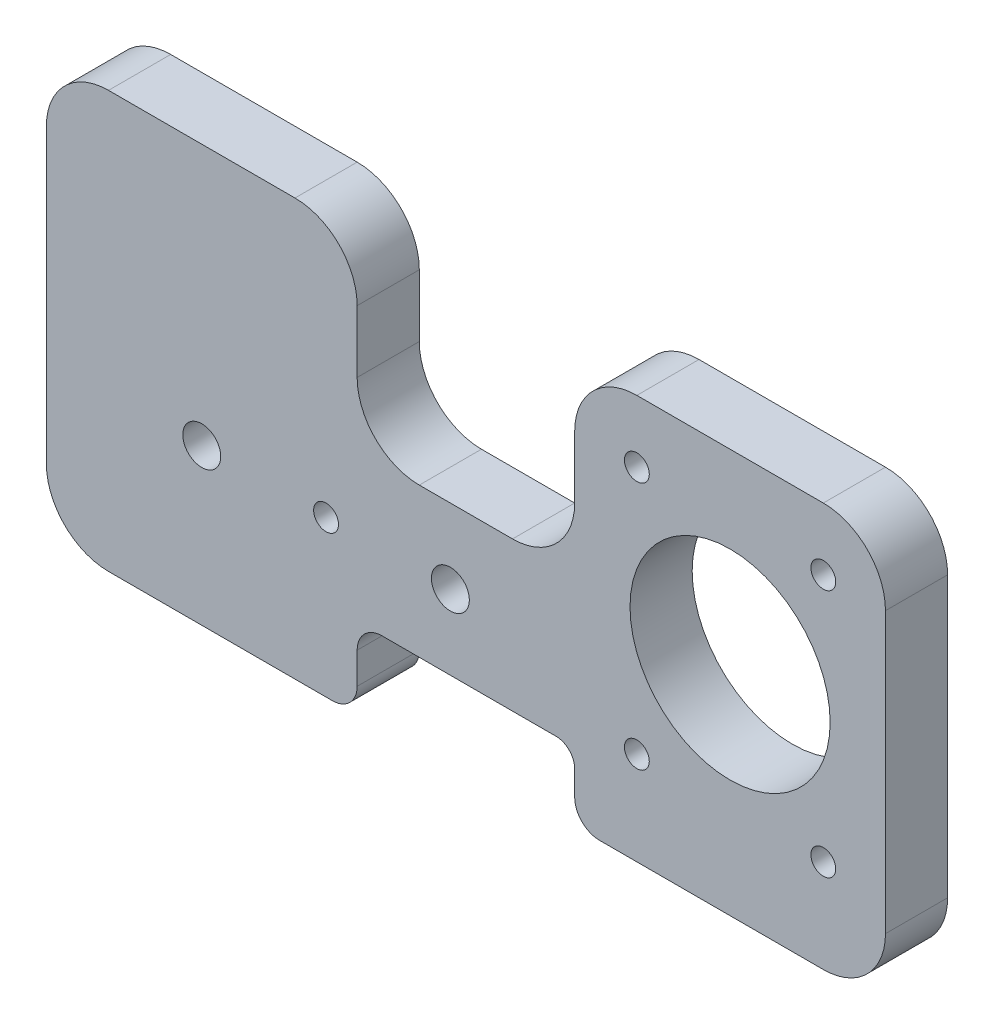
ISO-10303-21;
HEADER;
FILE_DESCRIPTION(('STEP AP214'),'2;1');
FILE_NAME('part.step','',(''),(''),'','','');
FILE_SCHEMA(('AUTOMOTIVE_DESIGN { 1 0 10303 214 1 1 1 1 }'));
ENDSEC;
DATA;
#1=APPLICATION_CONTEXT('core data for automotive mechanical design processes');
#2=APPLICATION_PROTOCOL_DEFINITION('international standard','automotive_design',2000,#1);
#3=PRODUCT_CONTEXT('',#1,'mechanical');
#4=PRODUCT('Part','Part','',(#3));
#5=PRODUCT_RELATED_PRODUCT_CATEGORY('part','',(#4));
#6=PRODUCT_DEFINITION_FORMATION('','',#4);
#7=PRODUCT_DEFINITION_CONTEXT('part definition',#1,'design');
#8=PRODUCT_DEFINITION('design','',#6,#7);
#9=PRODUCT_DEFINITION_SHAPE('','',#8);
#10=(LENGTH_UNIT() NAMED_UNIT(*) SI_UNIT(.MILLI.,.METRE.));
#11=(NAMED_UNIT(*) PLANE_ANGLE_UNIT() SI_UNIT($,.RADIAN.));
#12=(NAMED_UNIT(*) SI_UNIT($,.STERADIAN.) SOLID_ANGLE_UNIT());
#13=UNCERTAINTY_MEASURE_WITH_UNIT(LENGTH_MEASURE(1.E-05),#10,'distance_accuracy_value','');
#14=(GEOMETRIC_REPRESENTATION_CONTEXT(3) GLOBAL_UNCERTAINTY_ASSIGNED_CONTEXT((#13)) GLOBAL_UNIT_ASSIGNED_CONTEXT((#10,
#11,#12)) REPRESENTATION_CONTEXT('',''));
#15=CARTESIAN_POINT('',(0.,0.,0.));
#16=DIRECTION('',(0.,0.,1.));
#17=DIRECTION('',(1.,0.,0.));
#18=AXIS2_PLACEMENT_3D('',#15,#16,#17);
#19=CARTESIAN_POINT('',(110.9105691057,-0.999999999999983,10.));
#20=DIRECTION('',(0.,0.,1.));
#21=DIRECTION('',(1.,0.,0.));
#22=AXIS2_PLACEMENT_3D('',#19,#20,#21);
#23=PLANE('',#22);
#24=CARTESIAN_POINT('',(131.9105691057,30.,10.));
#25=DIRECTION('',(0.,0.,1.));
#26=DIRECTION('',(1.,0.,0.));
#27=AXIS2_PLACEMENT_3D('',#24,#25,#26);
#28=CIRCLE('',#27,16.1);
#29=CARTESIAN_POINT('',(148.0105691057,30.,10.));
#30=VERTEX_POINT('',#29);
#31=EDGE_CURVE('E457',#30,#30,#28,.T.);
#32=ORIENTED_EDGE('',*,*,#31,.F.);
#33=EDGE_LOOP('',(#32));
#34=FACE_BOUND('',#33,.T.);
#35=CARTESIAN_POINT('',(146.9105691057,50.,10.));
#36=DIRECTION('',(0.,0.,1.));
#37=DIRECTION('',(1.,0.,0.));
#38=AXIS2_PLACEMENT_3D('',#35,#36,#37);
#39=CIRCLE('',#38,1.99999999999997);
#40=CARTESIAN_POINT('',(148.9105691057,50.,10.));
#41=VERTEX_POINT('',#40);
#42=EDGE_CURVE('E474',#41,#41,#39,.T.);
#43=ORIENTED_EDGE('',*,*,#42,.F.);
#44=EDGE_LOOP('',(#43));
#45=FACE_BOUND('',#44,.T.);
#46=CARTESIAN_POINT('',(116.9105691057,10.,10.));
#47=DIRECTION('',(0.,0.,1.));
#48=DIRECTION('',(1.,0.,0.));
#49=AXIS2_PLACEMENT_3D('',#46,#47,#48);
#50=CIRCLE('',#49,2.00000000000002);
#51=CARTESIAN_POINT('',(118.9105691057,10.,10.));
#52=VERTEX_POINT('',#51);
#53=EDGE_CURVE('E486',#52,#52,#50,.T.);
#54=ORIENTED_EDGE('',*,*,#53,.F.);
#55=EDGE_LOOP('',(#54));
#56=FACE_BOUND('',#55,.T.);
#57=CARTESIAN_POINT('',(66.9105691057,18.,10.));
#58=DIRECTION('',(0.,0.,1.));
#59=DIRECTION('',(1.,0.,0.));
#60=AXIS2_PLACEMENT_3D('',#57,#58,#59);
#61=CIRCLE('',#60,1.99999999999999);
#62=CARTESIAN_POINT('',(68.9105691057,18.,10.));
#63=VERTEX_POINT('',#62);
#64=EDGE_CURVE('E230',#63,#63,#61,.T.);
#65=ORIENTED_EDGE('',*,*,#64,.F.);
#66=EDGE_LOOP('',(#65));
#67=FACE_BOUND('',#66,.T.);
#68=CARTESIAN_POINT('',(110.9105691057,-0.999999999999983,10.));
#69=DIRECTION('',(0.,0.,1.));
#70=DIRECTION('',(1.,0.,0.));
#71=AXIS2_PLACEMENT_3D('',#68,#69,#70);
#72=CIRCLE('',#71,4.00000000000002);
#73=CARTESIAN_POINT('',(106.9105691057,-1.,10.));
#74=VERTEX_POINT('',#73);
#75=CARTESIAN_POINT('',(110.9105691057,-5.,10.));
#76=VERTEX_POINT('',#75);
#77=EDGE_CURVE('E273',#74,#76,#72,.T.);
#78=ORIENTED_EDGE('',*,*,#77,.T.);
#79=DIRECTION('',(1.,0.,0.));
#80=VECTOR('',#79,1.);
#81=CARTESIAN_POINT('',(146.9105691057,-5.,10.));
#82=LINE('',#81,#80);
#83=CARTESIAN_POINT('',(146.9105691057,-5.,10.));
#84=VERTEX_POINT('',#83);
#85=EDGE_CURVE('E141',#76,#84,#82,.T.);
#86=ORIENTED_EDGE('',*,*,#85,.T.);
#87=CARTESIAN_POINT('',(146.9105691057,5.00000000000001,10.));
#88=DIRECTION('',(0.,0.,1.));
#89=DIRECTION('',(1.,0.,0.));
#90=AXIS2_PLACEMENT_3D('',#87,#88,#89);
#91=CIRCLE('',#90,10.);
#92=CARTESIAN_POINT('',(156.9105691057,5.,10.));
#93=VERTEX_POINT('',#92);
#94=EDGE_CURVE('E336',#84,#93,#91,.T.);
#95=ORIENTED_EDGE('',*,*,#94,.T.);
#96=DIRECTION('',(0.,1.,0.));
#97=VECTOR('',#96,1.);
#98=CARTESIAN_POINT('',(156.9105691057,5.,10.));
#99=LINE('',#98,#97);
#100=CARTESIAN_POINT('',(156.9105691057,50.,10.));
#101=VERTEX_POINT('',#100);
#102=EDGE_CURVE('E355',#93,#101,#99,.T.);
#103=ORIENTED_EDGE('',*,*,#102,.T.);
#104=CARTESIAN_POINT('',(146.9105691057,50.,10.));
#105=DIRECTION('',(0.,0.,1.));
#106=DIRECTION('',(1.,0.,0.));
#107=AXIS2_PLACEMENT_3D('',#104,#105,#106);
#108=CIRCLE('',#107,10.);
#109=CARTESIAN_POINT('',(146.9105691057,60.,10.));
#110=VERTEX_POINT('',#109);
#111=EDGE_CURVE('E352',#101,#110,#108,.T.);
#112=ORIENTED_EDGE('',*,*,#111,.T.);
#113=DIRECTION('',(-1.,0.,0.));
#114=VECTOR('',#113,1.);
#115=CARTESIAN_POINT('',(146.9105691057,60.,10.));
#116=LINE('',#115,#114);
#117=CARTESIAN_POINT('',(116.9105691057,60.,10.));
#118=VERTEX_POINT('',#117);
#119=EDGE_CURVE('E354',#110,#118,#116,.T.);
#120=ORIENTED_EDGE('',*,*,#119,.T.);
#121=CARTESIAN_POINT('',(116.9105691057,50.,10.));
#122=DIRECTION('',(0.,0.,1.));
#123=DIRECTION('',(1.,0.,0.));
#124=AXIS2_PLACEMENT_3D('',#121,#122,#123);
#125=CIRCLE('',#124,10.);
#126=CARTESIAN_POINT('',(106.9105691057,50.,10.));
#127=VERTEX_POINT('',#126);
#128=EDGE_CURVE('E357',#118,#127,#125,.T.);
#129=ORIENTED_EDGE('',*,*,#128,.T.);
#130=DIRECTION('',(0.,-1.,0.));
#131=VECTOR('',#130,1.);
#132=CARTESIAN_POINT('',(106.9105691057,50.,10.));
#133=LINE('',#132,#131);
#134=CARTESIAN_POINT('',(106.9105691057,40.0000000000001,10.));
#135=VERTEX_POINT('',#134);
#136=EDGE_CURVE('E363',#127,#135,#133,.T.);
#137=ORIENTED_EDGE('',*,*,#136,.T.);
#138=CARTESIAN_POINT('',(96.9105691056999,40.0000000000001,10.));
#139=DIRECTION('',(0.,0.,-1.));
#140=DIRECTION('',(1.,0.,0.));
#141=AXIS2_PLACEMENT_3D('',#138,#139,#140);
#142=CIRCLE('',#141,10.0000000000001);
#143=CARTESIAN_POINT('',(96.9105691057,30.,10.));
#144=VERTEX_POINT('',#143);
#145=EDGE_CURVE('E365',#135,#144,#142,.T.);
#146=ORIENTED_EDGE('',*,*,#145,.T.);
#147=DIRECTION('',(-1.,0.,0.));
#148=VECTOR('',#147,1.);
#149=CARTESIAN_POINT('',(96.9105691057,30.,10.));
#150=LINE('',#149,#148);
#151=CARTESIAN_POINT('',(81.9105691057,30.,10.));
#152=VERTEX_POINT('',#151);
#153=EDGE_CURVE('E367',#144,#152,#150,.T.);
#154=ORIENTED_EDGE('',*,*,#153,.T.);
#155=CARTESIAN_POINT('',(81.9105691057,40.,10.));
#156=DIRECTION('',(0.,0.,-1.));
#157=DIRECTION('',(1.,0.,0.));
#158=AXIS2_PLACEMENT_3D('',#155,#156,#157);
#159=CIRCLE('',#158,10.);
#160=CARTESIAN_POINT('',(71.9105691057,40.,10.));
#161=VERTEX_POINT('',#160);
#162=EDGE_CURVE('E369',#152,#161,#159,.T.);
#163=ORIENTED_EDGE('',*,*,#162,.T.);
#164=DIRECTION('',(0.,1.,0.));
#165=VECTOR('',#164,1.);
#166=CARTESIAN_POINT('',(71.9105691057,50.,10.));
#167=LINE('',#166,#165);
#168=CARTESIAN_POINT('',(71.9105691057,50.,10.));
#169=VERTEX_POINT('',#168);
#170=EDGE_CURVE('E371',#161,#169,#167,.T.);
#171=ORIENTED_EDGE('',*,*,#170,.T.);
#172=CARTESIAN_POINT('',(61.9105691057,50.,10.));
#173=DIRECTION('',(0.,0.,1.));
#174=DIRECTION('',(1.,0.,0.));
#175=AXIS2_PLACEMENT_3D('',#172,#173,#174);
#176=CIRCLE('',#175,10.);
#177=CARTESIAN_POINT('',(61.9105691057,60.,10.));
#178=VERTEX_POINT('',#177);
#179=EDGE_CURVE('E373',#169,#178,#176,.T.);
#180=ORIENTED_EDGE('',*,*,#179,.T.);
#181=DIRECTION('',(-1.,0.,0.));
#182=VECTOR('',#181,1.);
#183=CARTESIAN_POINT('',(31.9105691057,60.,10.));
#184=LINE('',#183,#182);
#185=CARTESIAN_POINT('',(31.9105691057,60.,10.));
#186=VERTEX_POINT('',#185);
#187=EDGE_CURVE('E375',#178,#186,#184,.T.);
#188=ORIENTED_EDGE('',*,*,#187,.T.);
#189=CARTESIAN_POINT('',(31.9105691057,50.,10.));
#190=DIRECTION('',(0.,0.,1.));
#191=DIRECTION('',(1.,0.,0.));
#192=AXIS2_PLACEMENT_3D('',#189,#190,#191);
#193=CIRCLE('',#192,10.);
#194=CARTESIAN_POINT('',(21.9105691057,50.,10.));
#195=VERTEX_POINT('',#194);
#196=EDGE_CURVE('E377',#186,#195,#193,.T.);
#197=ORIENTED_EDGE('',*,*,#196,.T.);
#198=DIRECTION('',(0.,-1.,0.));
#199=VECTOR('',#198,1.);
#200=CARTESIAN_POINT('',(21.9105691057,2.9650844795,10.));
#201=LINE('',#200,#199);
#202=CARTESIAN_POINT('',(21.9105691057,2.9650844795,10.));
#203=VERTEX_POINT('',#202);
#204=EDGE_CURVE('E379',#195,#203,#201,.T.);
#205=ORIENTED_EDGE('',*,*,#204,.T.);
#206=CARTESIAN_POINT('',(31.9105691057,2.96508447950001,10.));
#207=DIRECTION('',(0.,0.,1.));
#208=DIRECTION('',(1.,0.,0.));
#209=AXIS2_PLACEMENT_3D('',#206,#207,#208);
#210=CIRCLE('',#209,10.);
#211=CARTESIAN_POINT('',(31.9105691057,-7.0349155205,10.));
#212=VERTEX_POINT('',#211);
#213=EDGE_CURVE('E381',#203,#212,#210,.T.);
#214=ORIENTED_EDGE('',*,*,#213,.T.);
#215=DIRECTION('',(1.,0.,0.));
#216=VECTOR('',#215,1.);
#217=CARTESIAN_POINT('',(67.9105691057,-7.0349155205,10.));
#218=LINE('',#217,#216);
#219=CARTESIAN_POINT('',(67.9105691057,-7.0349155205,10.));
#220=VERTEX_POINT('',#219);
#221=EDGE_CURVE('E383',#212,#220,#218,.T.);
#222=ORIENTED_EDGE('',*,*,#221,.T.);
#223=CARTESIAN_POINT('',(67.9105691057,-3.0349155205,10.));
#224=DIRECTION('',(0.,0.,1.));
#225=DIRECTION('',(1.,0.,0.));
#226=AXIS2_PLACEMENT_3D('',#223,#224,#225);
#227=CIRCLE('',#226,4.);
#228=CARTESIAN_POINT('',(71.9105691057,-3.0349155205,10.));
#229=VERTEX_POINT('',#228);
#230=EDGE_CURVE('E385',#220,#229,#227,.T.);
#231=ORIENTED_EDGE('',*,*,#230,.T.);
#232=DIRECTION('',(0.,1.,0.));
#233=VECTOR('',#232,1.);
#234=CARTESIAN_POINT('',(71.9105691057,2.,10.));
#235=LINE('',#234,#233);
#236=CARTESIAN_POINT('',(71.9105691057,2.,10.));
#237=VERTEX_POINT('',#236);
#238=EDGE_CURVE('E387',#229,#237,#235,.T.);
#239=ORIENTED_EDGE('',*,*,#238,.T.);
#240=CARTESIAN_POINT('',(75.9105691057,2.,10.));
#241=DIRECTION('',(0.,0.,-1.));
#242=DIRECTION('',(1.,0.,0.));
#243=AXIS2_PLACEMENT_3D('',#240,#241,#242);
#244=CIRCLE('',#243,4.00000000000001);
#245=CARTESIAN_POINT('',(75.9105691057,6.,10.));
#246=VERTEX_POINT('',#245);
#247=EDGE_CURVE('E208',#237,#246,#244,.T.);
#248=ORIENTED_EDGE('',*,*,#247,.T.);
#249=DIRECTION('',(1.,0.,0.));
#250=VECTOR('',#249,1.);
#251=CARTESIAN_POINT('',(75.9105691057,6.,10.));
#252=LINE('',#251,#250);
#253=CARTESIAN_POINT('',(103.9105691057,5.99999999999999,10.));
#254=VERTEX_POINT('',#253);
#255=EDGE_CURVE('E202',#246,#254,#252,.T.);
#256=ORIENTED_EDGE('',*,*,#255,.T.);
#257=CARTESIAN_POINT('',(103.9105691057,2.99999999999994,10.));
#258=DIRECTION('',(0.,0.,-1.));
#259=DIRECTION('',(1.,0.,0.));
#260=AXIS2_PLACEMENT_3D('',#257,#258,#259);
#261=CIRCLE('',#260,3.00000000000005);
#262=CARTESIAN_POINT('',(106.9105691057,3.,10.));
#263=VERTEX_POINT('',#262);
#264=EDGE_CURVE('E206',#254,#263,#261,.T.);
#265=ORIENTED_EDGE('',*,*,#264,.T.);
#266=DIRECTION('',(0.,-1.,0.));
#267=VECTOR('',#266,1.);
#268=CARTESIAN_POINT('',(106.9105691057,-1.,10.));
#269=LINE('',#268,#267);
#270=EDGE_CURVE('E50',#263,#74,#269,.T.);
#271=ORIENTED_EDGE('',*,*,#270,.T.);
#272=EDGE_LOOP('',(#78,#86,#95,#103,#112,#120,#129,#137,#146,#154,#163,#171,#180,#188,#197,#205,
#214,#222,#231,#239,#248,#256,#265,#271));
#273=FACE_BOUND('',#272,.T.);
#274=CARTESIAN_POINT('',(46.9105691057,18.,10.));
#275=DIRECTION('',(0.,0.,1.));
#276=DIRECTION('',(1.,0.,0.));
#277=AXIS2_PLACEMENT_3D('',#274,#275,#276);
#278=CIRCLE('',#277,3.05);
#279=CARTESIAN_POINT('',(49.9605691057,18.,10.));
#280=VERTEX_POINT('',#279);
#281=EDGE_CURVE('E492',#280,#280,#278,.T.);
#282=ORIENTED_EDGE('',*,*,#281,.F.);
#283=EDGE_LOOP('',(#282));
#284=FACE_BOUND('',#283,.T.);
#285=CARTESIAN_POINT('',(146.9105691057,10.,10.));
#286=DIRECTION('',(0.,0.,1.));
#287=DIRECTION('',(1.,0.,0.));
#288=AXIS2_PLACEMENT_3D('',#285,#286,#287);
#289=CIRCLE('',#288,1.99999999999997);
#290=CARTESIAN_POINT('',(148.9105691057,10.,10.));
#291=VERTEX_POINT('',#290);
#292=EDGE_CURVE('E480',#291,#291,#289,.T.);
#293=ORIENTED_EDGE('',*,*,#292,.F.);
#294=EDGE_LOOP('',(#293));
#295=FACE_BOUND('',#294,.T.);
#296=CARTESIAN_POINT('',(116.9105691057,50.,10.));
#297=DIRECTION('',(0.,0.,1.));
#298=DIRECTION('',(1.,0.,0.));
#299=AXIS2_PLACEMENT_3D('',#296,#297,#298);
#300=CIRCLE('',#299,2.00000000000002);
#301=CARTESIAN_POINT('',(118.9105691057,50.,10.));
#302=VERTEX_POINT('',#301);
#303=EDGE_CURVE('E468',#302,#302,#300,.T.);
#304=ORIENTED_EDGE('',*,*,#303,.F.);
#305=EDGE_LOOP('',(#304));
#306=FACE_BOUND('',#305,.T.);
#307=CARTESIAN_POINT('',(86.9105691057,18.,10.));
#308=DIRECTION('',(0.,0.,1.));
#309=DIRECTION('',(1.,0.,0.));
#310=AXIS2_PLACEMENT_3D('',#307,#308,#309);
#311=CIRCLE('',#310,3.05);
#312=CARTESIAN_POINT('',(89.9605691057,18.,10.));
#313=VERTEX_POINT('',#312);
#314=EDGE_CURVE('E462',#313,#313,#311,.T.);
#315=ORIENTED_EDGE('',*,*,#314,.F.);
#316=EDGE_LOOP('',(#315));
#317=FACE_BOUND('',#316,.T.);
#318=ADVANCED_FACE('F33',(#34,#45,#56,#67,#273,#284,#295,#306,#317),#23,.T.);
#319=CARTESIAN_POINT('',(110.9105691057,-0.999999999999983,0.));
#320=DIRECTION('',(0.,0.,1.));
#321=DIRECTION('',(1.,0.,0.));
#322=AXIS2_PLACEMENT_3D('',#319,#320,#321);
#323=PLANE('',#322);
#324=CARTESIAN_POINT('',(131.9105691057,30.,0.));
#325=DIRECTION('',(0.,0.,1.));
#326=DIRECTION('',(1.,0.,0.));
#327=AXIS2_PLACEMENT_3D('',#324,#325,#326);
#328=CIRCLE('',#327,16.1);
#329=CARTESIAN_POINT('',(148.0105691057,30.,0.));
#330=VERTEX_POINT('',#329);
#331=EDGE_CURVE('E455',#330,#330,#328,.T.);
#332=ORIENTED_EDGE('',*,*,#331,.T.);
#333=EDGE_LOOP('',(#332));
#334=FACE_BOUND('',#333,.T.);
#335=CARTESIAN_POINT('',(110.9105691057,-0.999999999999983,0.));
#336=DIRECTION('',(0.,0.,1.));
#337=DIRECTION('',(1.,0.,0.));
#338=AXIS2_PLACEMENT_3D('',#335,#336,#337);
#339=CIRCLE('',#338,4.00000000000002);
#340=CARTESIAN_POINT('',(106.9105691057,-1.,0.));
#341=VERTEX_POINT('',#340);
#342=CARTESIAN_POINT('',(110.9105691057,-5.,0.));
#343=VERTEX_POINT('',#342);
#344=EDGE_CURVE('E226',#341,#343,#339,.T.);
#345=ORIENTED_EDGE('',*,*,#344,.F.);
#346=DIRECTION('',(0.,-1.,0.));
#347=VECTOR('',#346,1.);
#348=CARTESIAN_POINT('',(106.9105691057,-1.,0.));
#349=LINE('',#348,#347);
#350=CARTESIAN_POINT('',(106.9105691057,3.,0.));
#351=VERTEX_POINT('',#350);
#352=EDGE_CURVE('E133',#351,#341,#349,.T.);
#353=ORIENTED_EDGE('',*,*,#352,.F.);
#354=CARTESIAN_POINT('',(103.9105691057,2.99999999999994,0.));
#355=DIRECTION('',(0.,0.,-1.));
#356=DIRECTION('',(1.,0.,0.));
#357=AXIS2_PLACEMENT_3D('',#354,#355,#356);
#358=CIRCLE('',#357,3.00000000000005);
#359=CARTESIAN_POINT('',(103.9105691057,5.99999999999999,0.));
#360=VERTEX_POINT('',#359);
#361=EDGE_CURVE('E127',#360,#351,#358,.T.);
#362=ORIENTED_EDGE('',*,*,#361,.F.);
#363=DIRECTION('',(1.,0.,0.));
#364=VECTOR('',#363,1.);
#365=CARTESIAN_POINT('',(75.9105691057,6.,0.));
#366=LINE('',#365,#364);
#367=CARTESIAN_POINT('',(75.9105691057,6.,0.));
#368=VERTEX_POINT('',#367);
#369=EDGE_CURVE('E216',#368,#360,#366,.T.);
#370=ORIENTED_EDGE('',*,*,#369,.F.);
#371=CARTESIAN_POINT('',(75.9105691057,2.,0.));
#372=DIRECTION('',(0.,0.,-1.));
#373=DIRECTION('',(1.,0.,0.));
#374=AXIS2_PLACEMENT_3D('',#371,#372,#373);
#375=CIRCLE('',#374,4.00000000000001);
#376=CARTESIAN_POINT('',(71.9105691057,2.,0.));
#377=VERTEX_POINT('',#376);
#378=EDGE_CURVE('E268',#377,#368,#375,.T.);
#379=ORIENTED_EDGE('',*,*,#378,.F.);
#380=DIRECTION('',(0.,1.,0.));
#381=VECTOR('',#380,1.);
#382=CARTESIAN_POINT('',(71.9105691057,2.,0.));
#383=LINE('',#382,#381);
#384=CARTESIAN_POINT('',(71.9105691057,-3.0349155205,0.));
#385=VERTEX_POINT('',#384);
#386=EDGE_CURVE('E266',#385,#377,#383,.T.);
#387=ORIENTED_EDGE('',*,*,#386,.F.);
#388=CARTESIAN_POINT('',(67.9105691057,-3.0349155205,0.));
#389=DIRECTION('',(0.,0.,1.));
#390=DIRECTION('',(1.,0.,0.));
#391=AXIS2_PLACEMENT_3D('',#388,#389,#390);
#392=CIRCLE('',#391,4.);
#393=CARTESIAN_POINT('',(67.9105691057,-7.0349155205,0.));
#394=VERTEX_POINT('',#393);
#395=EDGE_CURVE('E264',#394,#385,#392,.T.);
#396=ORIENTED_EDGE('',*,*,#395,.F.);
#397=DIRECTION('',(1.,0.,0.));
#398=VECTOR('',#397,1.);
#399=CARTESIAN_POINT('',(67.9105691057,-7.0349155205,0.));
#400=LINE('',#399,#398);
#401=CARTESIAN_POINT('',(31.9105691057,-7.0349155205,0.));
#402=VERTEX_POINT('',#401);
#403=EDGE_CURVE('E262',#402,#394,#400,.T.);
#404=ORIENTED_EDGE('',*,*,#403,.F.);
#405=CARTESIAN_POINT('',(31.9105691057,2.96508447950001,0.));
#406=DIRECTION('',(0.,0.,1.));
#407=DIRECTION('',(1.,0.,0.));
#408=AXIS2_PLACEMENT_3D('',#405,#406,#407);
#409=CIRCLE('',#408,10.);
#410=CARTESIAN_POINT('',(21.9105691057,2.9650844795,0.));
#411=VERTEX_POINT('',#410);
#412=EDGE_CURVE('E260',#411,#402,#409,.T.);
#413=ORIENTED_EDGE('',*,*,#412,.F.);
#414=DIRECTION('',(0.,-1.,0.));
#415=VECTOR('',#414,1.);
#416=CARTESIAN_POINT('',(21.9105691057,2.9650844795,0.));
#417=LINE('',#416,#415);
#418=CARTESIAN_POINT('',(21.9105691057,50.,0.));
#419=VERTEX_POINT('',#418);
#420=EDGE_CURVE('E258',#419,#411,#417,.T.);
#421=ORIENTED_EDGE('',*,*,#420,.F.);
#422=CARTESIAN_POINT('',(31.9105691057,50.,0.));
#423=DIRECTION('',(0.,0.,1.));
#424=DIRECTION('',(1.,0.,0.));
#425=AXIS2_PLACEMENT_3D('',#422,#423,#424);
#426=CIRCLE('',#425,10.);
#427=CARTESIAN_POINT('',(31.9105691057,60.,0.));
#428=VERTEX_POINT('',#427);
#429=EDGE_CURVE('E256',#428,#419,#426,.T.);
#430=ORIENTED_EDGE('',*,*,#429,.F.);
#431=DIRECTION('',(-1.,0.,0.));
#432=VECTOR('',#431,1.);
#433=CARTESIAN_POINT('',(31.9105691057,60.,0.));
#434=LINE('',#433,#432);
#435=CARTESIAN_POINT('',(61.9105691057,60.,0.));
#436=VERTEX_POINT('',#435);
#437=EDGE_CURVE('E254',#436,#428,#434,.T.);
#438=ORIENTED_EDGE('',*,*,#437,.F.);
#439=CARTESIAN_POINT('',(61.9105691057,50.,0.));
#440=DIRECTION('',(0.,0.,1.));
#441=DIRECTION('',(1.,0.,0.));
#442=AXIS2_PLACEMENT_3D('',#439,#440,#441);
#443=CIRCLE('',#442,10.);
#444=CARTESIAN_POINT('',(71.9105691057,50.,0.));
#445=VERTEX_POINT('',#444);
#446=EDGE_CURVE('E252',#445,#436,#443,.T.);
#447=ORIENTED_EDGE('',*,*,#446,.F.);
#448=DIRECTION('',(0.,1.,0.));
#449=VECTOR('',#448,1.);
#450=CARTESIAN_POINT('',(71.9105691057,50.,0.));
#451=LINE('',#450,#449);
#452=CARTESIAN_POINT('',(71.9105691057,40.,0.));
#453=VERTEX_POINT('',#452);
#454=EDGE_CURVE('E250',#453,#445,#451,.T.);
#455=ORIENTED_EDGE('',*,*,#454,.F.);
#456=CARTESIAN_POINT('',(81.9105691057,40.,0.));
#457=DIRECTION('',(0.,0.,-1.));
#458=DIRECTION('',(1.,0.,0.));
#459=AXIS2_PLACEMENT_3D('',#456,#457,#458);
#460=CIRCLE('',#459,10.);
#461=CARTESIAN_POINT('',(81.9105691057,30.,0.));
#462=VERTEX_POINT('',#461);
#463=EDGE_CURVE('E248',#462,#453,#460,.T.);
#464=ORIENTED_EDGE('',*,*,#463,.F.);
#465=DIRECTION('',(-1.,0.,0.));
#466=VECTOR('',#465,1.);
#467=CARTESIAN_POINT('',(96.9105691057,30.,0.));
#468=LINE('',#467,#466);
#469=CARTESIAN_POINT('',(96.9105691057,30.,0.));
#470=VERTEX_POINT('',#469);
#471=EDGE_CURVE('E246',#470,#462,#468,.T.);
#472=ORIENTED_EDGE('',*,*,#471,.F.);
#473=CARTESIAN_POINT('',(96.9105691056999,40.0000000000001,0.));
#474=DIRECTION('',(0.,0.,-1.));
#475=DIRECTION('',(1.,0.,0.));
#476=AXIS2_PLACEMENT_3D('',#473,#474,#475);
#477=CIRCLE('',#476,10.0000000000001);
#478=CARTESIAN_POINT('',(106.9105691057,40.0000000000001,0.));
#479=VERTEX_POINT('',#478);
#480=EDGE_CURVE('E244',#479,#470,#477,.T.);
#481=ORIENTED_EDGE('',*,*,#480,.F.);
#482=DIRECTION('',(0.,-1.,0.));
#483=VECTOR('',#482,1.);
#484=CARTESIAN_POINT('',(106.9105691057,50.,0.));
#485=LINE('',#484,#483);
#486=CARTESIAN_POINT('',(106.9105691057,50.,0.));
#487=VERTEX_POINT('',#486);
#488=EDGE_CURVE('E242',#487,#479,#485,.T.);
#489=ORIENTED_EDGE('',*,*,#488,.F.);
#490=CARTESIAN_POINT('',(116.9105691057,50.,0.));
#491=DIRECTION('',(0.,0.,1.));
#492=DIRECTION('',(1.,0.,0.));
#493=AXIS2_PLACEMENT_3D('',#490,#491,#492);
#494=CIRCLE('',#493,10.);
#495=CARTESIAN_POINT('',(116.9105691057,60.,0.));
#496=VERTEX_POINT('',#495);
#497=EDGE_CURVE('E240',#496,#487,#494,.T.);
#498=ORIENTED_EDGE('',*,*,#497,.F.);
#499=DIRECTION('',(-1.,0.,0.));
#500=VECTOR('',#499,1.);
#501=CARTESIAN_POINT('',(146.9105691057,60.,0.));
#502=LINE('',#501,#500);
#503=CARTESIAN_POINT('',(146.9105691057,60.,0.));
#504=VERTEX_POINT('',#503);
#505=EDGE_CURVE('E238',#504,#496,#502,.T.);
#506=ORIENTED_EDGE('',*,*,#505,.F.);
#507=CARTESIAN_POINT('',(146.9105691057,50.,0.));
#508=DIRECTION('',(0.,0.,1.));
#509=DIRECTION('',(1.,0.,0.));
#510=AXIS2_PLACEMENT_3D('',#507,#508,#509);
#511=CIRCLE('',#510,10.);
#512=CARTESIAN_POINT('',(156.9105691057,50.,0.));
#513=VERTEX_POINT('',#512);
#514=EDGE_CURVE('E236',#513,#504,#511,.T.);
#515=ORIENTED_EDGE('',*,*,#514,.F.);
#516=DIRECTION('',(0.,1.,0.));
#517=VECTOR('',#516,1.);
#518=CARTESIAN_POINT('',(156.9105691057,5.,0.));
#519=LINE('',#518,#517);
#520=CARTESIAN_POINT('',(156.9105691057,5.,0.));
#521=VERTEX_POINT('',#520);
#522=EDGE_CURVE('E234',#521,#513,#519,.T.);
#523=ORIENTED_EDGE('',*,*,#522,.F.);
#524=CARTESIAN_POINT('',(146.9105691057,5.00000000000001,0.));
#525=DIRECTION('',(0.,0.,1.));
#526=DIRECTION('',(1.,0.,0.));
#527=AXIS2_PLACEMENT_3D('',#524,#525,#526);
#528=CIRCLE('',#527,10.);
#529=CARTESIAN_POINT('',(146.9105691057,-5.,0.));
#530=VERTEX_POINT('',#529);
#531=EDGE_CURVE('E232',#530,#521,#528,.T.);
#532=ORIENTED_EDGE('',*,*,#531,.F.);
#533=DIRECTION('',(1.,0.,0.));
#534=VECTOR('',#533,1.);
#535=CARTESIAN_POINT('',(146.9105691057,-5.,0.));
#536=LINE('',#535,#534);
#537=EDGE_CURVE('E229',#343,#530,#536,.T.);
#538=ORIENTED_EDGE('',*,*,#537,.F.);
#539=EDGE_LOOP('',(#345,#353,#362,#370,#379,#387,#396,#404,#413,#421,#430,#438,#447,#455,#464,
#472,#481,#489,#498,#506,#515,#523,#532,#538));
#540=FACE_BOUND('',#539,.T.);
#541=CARTESIAN_POINT('',(66.9105691057,18.,0.));
#542=DIRECTION('',(0.,0.,1.));
#543=DIRECTION('',(1.,0.,0.));
#544=AXIS2_PLACEMENT_3D('',#541,#542,#543);
#545=CIRCLE('',#544,1.99999999999999);
#546=CARTESIAN_POINT('',(68.9105691057,18.,0.));
#547=VERTEX_POINT('',#546);
#548=EDGE_CURVE('E495',#547,#547,#545,.T.);
#549=ORIENTED_EDGE('',*,*,#548,.T.);
#550=EDGE_LOOP('',(#549));
#551=FACE_BOUND('',#550,.T.);
#552=CARTESIAN_POINT('',(46.9105691057,18.,0.));
#553=DIRECTION('',(0.,0.,1.));
#554=DIRECTION('',(1.,0.,0.));
#555=AXIS2_PLACEMENT_3D('',#552,#553,#554);
#556=CIRCLE('',#555,3.05);
#557=CARTESIAN_POINT('',(49.9605691057,18.,0.));
#558=VERTEX_POINT('',#557);
#559=EDGE_CURVE('E489',#558,#558,#556,.T.);
#560=ORIENTED_EDGE('',*,*,#559,.T.);
#561=EDGE_LOOP('',(#560));
#562=FACE_BOUND('',#561,.T.);
#563=CARTESIAN_POINT('',(116.9105691057,10.,0.));
#564=DIRECTION('',(0.,0.,1.));
#565=DIRECTION('',(1.,0.,0.));
#566=AXIS2_PLACEMENT_3D('',#563,#564,#565);
#567=CIRCLE('',#566,2.00000000000002);
#568=CARTESIAN_POINT('',(118.9105691057,10.,0.));
#569=VERTEX_POINT('',#568);
#570=EDGE_CURVE('E483',#569,#569,#567,.T.);
#571=ORIENTED_EDGE('',*,*,#570,.T.);
#572=EDGE_LOOP('',(#571));
#573=FACE_BOUND('',#572,.T.);
#574=CARTESIAN_POINT('',(146.9105691057,10.,0.));
#575=DIRECTION('',(0.,0.,1.));
#576=DIRECTION('',(1.,0.,0.));
#577=AXIS2_PLACEMENT_3D('',#574,#575,#576);
#578=CIRCLE('',#577,1.99999999999997);
#579=CARTESIAN_POINT('',(148.9105691057,10.,0.));
#580=VERTEX_POINT('',#579);
#581=EDGE_CURVE('E477',#580,#580,#578,.T.);
#582=ORIENTED_EDGE('',*,*,#581,.T.);
#583=EDGE_LOOP('',(#582));
#584=FACE_BOUND('',#583,.T.);
#585=CARTESIAN_POINT('',(146.9105691057,50.,0.));
#586=DIRECTION('',(0.,0.,1.));
#587=DIRECTION('',(1.,0.,0.));
#588=AXIS2_PLACEMENT_3D('',#585,#586,#587);
#589=CIRCLE('',#588,1.99999999999997);
#590=CARTESIAN_POINT('',(148.9105691057,50.,0.));
#591=VERTEX_POINT('',#590);
#592=EDGE_CURVE('E471',#591,#591,#589,.T.);
#593=ORIENTED_EDGE('',*,*,#592,.T.);
#594=EDGE_LOOP('',(#593));
#595=FACE_BOUND('',#594,.T.);
#596=CARTESIAN_POINT('',(116.9105691057,50.,0.));
#597=DIRECTION('',(0.,0.,1.));
#598=DIRECTION('',(1.,0.,0.));
#599=AXIS2_PLACEMENT_3D('',#596,#597,#598);
#600=CIRCLE('',#599,2.00000000000002);
#601=CARTESIAN_POINT('',(118.9105691057,50.,0.));
#602=VERTEX_POINT('',#601);
#603=EDGE_CURVE('E465',#602,#602,#600,.T.);
#604=ORIENTED_EDGE('',*,*,#603,.T.);
#605=EDGE_LOOP('',(#604));
#606=FACE_BOUND('',#605,.T.);
#607=CARTESIAN_POINT('',(86.9105691057,18.,0.));
#608=DIRECTION('',(0.,0.,1.));
#609=DIRECTION('',(1.,0.,0.));
#610=AXIS2_PLACEMENT_3D('',#607,#608,#609);
#611=CIRCLE('',#610,3.05);
#612=CARTESIAN_POINT('',(89.9605691057,18.,0.));
#613=VERTEX_POINT('',#612);
#614=EDGE_CURVE('E459',#613,#613,#611,.T.);
#615=ORIENTED_EDGE('',*,*,#614,.T.);
#616=EDGE_LOOP('',(#615));
#617=FACE_BOUND('',#616,.T.);
#618=ADVANCED_FACE('F340',(#334,#540,#551,#562,#573,#584,#595,#606,#617),#323,.F.);
#619=CARTESIAN_POINT('',(110.9105691057,-0.999999999999983,10.));
#620=DIRECTION('',(0.,0.,-1.));
#621=DIRECTION('',(-1.,0.,0.));
#622=AXIS2_PLACEMENT_3D('',#619,#620,#621);
#623=CYLINDRICAL_SURFACE('',#622,4.00000000000002);
#624=ORIENTED_EDGE('',*,*,#344,.T.);
#625=DIRECTION('',(0.,0.,-1.));
#626=VECTOR('',#625,1.);
#627=CARTESIAN_POINT('',(110.9105691057,-5.,10.));
#628=LINE('',#627,#626);
#629=EDGE_CURVE('E11',#76,#343,#628,.T.);
#630=ORIENTED_EDGE('',*,*,#629,.F.);
#631=ORIENTED_EDGE('',*,*,#77,.F.);
#632=DIRECTION('',(0.,0.,-1.));
#633=VECTOR('',#632,1.);
#634=CARTESIAN_POINT('',(106.9105691057,-1.,10.));
#635=LINE('',#634,#633);
#636=EDGE_CURVE('E222',#74,#341,#635,.T.);
#637=ORIENTED_EDGE('',*,*,#636,.T.);
#638=EDGE_LOOP('',(#624,#630,#631,#637));
#639=FACE_BOUND('',#638,.T.);
#640=ADVANCED_FACE('F35',(#639),#623,.T.);
#641=CARTESIAN_POINT('',(146.9105691057,-5.,10.));
#642=DIRECTION('',(0.,1.,0.));
#643=DIRECTION('',(0.,0.,1.));
#644=AXIS2_PLACEMENT_3D('',#641,#642,#643);
#645=PLANE('',#644);
#646=ORIENTED_EDGE('',*,*,#537,.T.);
#647=DIRECTION('',(0.,0.,-1.));
#648=VECTOR('',#647,1.);
#649=CARTESIAN_POINT('',(146.9105691057,-5.,10.));
#650=LINE('',#649,#648);
#651=EDGE_CURVE('E42',#84,#530,#650,.T.);
#652=ORIENTED_EDGE('',*,*,#651,.F.);
#653=ORIENTED_EDGE('',*,*,#85,.F.);
#654=ORIENTED_EDGE('',*,*,#629,.T.);
#655=EDGE_LOOP('',(#646,#652,#653,#654));
#656=FACE_BOUND('',#655,.T.);
#657=ADVANCED_FACE('F763',(#656),#645,.F.);
#658=CARTESIAN_POINT('',(146.9105691057,5.00000000000001,10.));
#659=DIRECTION('',(0.,0.,-1.));
#660=DIRECTION('',(-1.,0.,0.));
#661=AXIS2_PLACEMENT_3D('',#658,#659,#660);
#662=CYLINDRICAL_SURFACE('',#661,10.);
#663=ORIENTED_EDGE('',*,*,#531,.T.);
#664=DIRECTION('',(0.,0.,-1.));
#665=VECTOR('',#664,1.);
#666=CARTESIAN_POINT('',(156.9105691057,5.,10.));
#667=LINE('',#666,#665);
#668=EDGE_CURVE('E328',#93,#521,#667,.T.);
#669=ORIENTED_EDGE('',*,*,#668,.F.);
#670=ORIENTED_EDGE('',*,*,#94,.F.);
#671=ORIENTED_EDGE('',*,*,#651,.T.);
#672=EDGE_LOOP('',(#663,#669,#670,#671));
#673=FACE_BOUND('',#672,.T.);
#674=ADVANCED_FACE('F334',(#673),#662,.T.);
#675=CARTESIAN_POINT('',(156.9105691057,5.,10.));
#676=DIRECTION('',(-1.,0.,0.));
#677=DIRECTION('',(0.,0.,1.));
#678=AXIS2_PLACEMENT_3D('',#675,#676,#677);
#679=PLANE('',#678);
#680=ORIENTED_EDGE('',*,*,#522,.T.);
#681=DIRECTION('',(0.,0.,-1.));
#682=VECTOR('',#681,1.);
#683=CARTESIAN_POINT('',(156.9105691057,50.,10.));
#684=LINE('',#683,#682);
#685=EDGE_CURVE('E325',#101,#513,#684,.T.);
#686=ORIENTED_EDGE('',*,*,#685,.F.);
#687=ORIENTED_EDGE('',*,*,#102,.F.);
#688=ORIENTED_EDGE('',*,*,#668,.T.);
#689=EDGE_LOOP('',(#680,#686,#687,#688));
#690=FACE_BOUND('',#689,.T.);
#691=ADVANCED_FACE('F346',(#690),#679,.F.);
#692=CARTESIAN_POINT('',(146.9105691057,50.,10.));
#693=DIRECTION('',(0.,0.,-1.));
#694=DIRECTION('',(-1.,0.,0.));
#695=AXIS2_PLACEMENT_3D('',#692,#693,#694);
#696=CYLINDRICAL_SURFACE('',#695,10.);
#697=ORIENTED_EDGE('',*,*,#514,.T.);
#698=DIRECTION('',(0.,0.,-1.));
#699=VECTOR('',#698,1.);
#700=CARTESIAN_POINT('',(146.9105691057,60.,10.));
#701=LINE('',#700,#699);
#702=EDGE_CURVE('E322',#110,#504,#701,.T.);
#703=ORIENTED_EDGE('',*,*,#702,.F.);
#704=ORIENTED_EDGE('',*,*,#111,.F.);
#705=ORIENTED_EDGE('',*,*,#685,.T.);
#706=EDGE_LOOP('',(#697,#703,#704,#705));
#707=FACE_BOUND('',#706,.T.);
#708=ADVANCED_FACE('F350',(#707),#696,.T.);
#709=CARTESIAN_POINT('',(146.9105691057,60.,10.));
#710=DIRECTION('',(0.,-1.,0.));
#711=DIRECTION('',(0.,0.,-1.));
#712=AXIS2_PLACEMENT_3D('',#709,#710,#711);
#713=PLANE('',#712);
#714=ORIENTED_EDGE('',*,*,#505,.T.);
#715=DIRECTION('',(0.,0.,-1.));
#716=VECTOR('',#715,1.);
#717=CARTESIAN_POINT('',(116.9105691057,60.,10.));
#718=LINE('',#717,#716);
#719=EDGE_CURVE('E319',#118,#496,#718,.T.);
#720=ORIENTED_EDGE('',*,*,#719,.F.);
#721=ORIENTED_EDGE('',*,*,#119,.F.);
#722=ORIENTED_EDGE('',*,*,#702,.T.);
#723=EDGE_LOOP('',(#714,#720,#721,#722));
#724=FACE_BOUND('',#723,.T.);
#725=ADVANCED_FACE('F728',(#724),#713,.F.);
#726=CARTESIAN_POINT('',(116.9105691057,50.,10.));
#727=DIRECTION('',(0.,0.,-1.));
#728=DIRECTION('',(-1.,0.,0.));
#729=AXIS2_PLACEMENT_3D('',#726,#727,#728);
#730=CYLINDRICAL_SURFACE('',#729,10.);
#731=ORIENTED_EDGE('',*,*,#497,.T.);
#732=DIRECTION('',(0.,0.,-1.));
#733=VECTOR('',#732,1.);
#734=CARTESIAN_POINT('',(106.9105691057,50.,10.));
#735=LINE('',#734,#733);
#736=EDGE_CURVE('E316',#127,#487,#735,.T.);
#737=ORIENTED_EDGE('',*,*,#736,.F.);
#738=ORIENTED_EDGE('',*,*,#128,.F.);
#739=ORIENTED_EDGE('',*,*,#719,.T.);
#740=EDGE_LOOP('',(#731,#737,#738,#739));
#741=FACE_BOUND('',#740,.T.);
#742=ADVANCED_FACE('F718',(#741),#730,.T.);
#743=CARTESIAN_POINT('',(106.9105691057,50.,10.));
#744=DIRECTION('',(1.,0.,0.));
#745=DIRECTION('',(0.,0.,-1.));
#746=AXIS2_PLACEMENT_3D('',#743,#744,#745);
#747=PLANE('',#746);
#748=ORIENTED_EDGE('',*,*,#488,.T.);
#749=DIRECTION('',(0.,0.,-1.));
#750=VECTOR('',#749,1.);
#751=CARTESIAN_POINT('',(106.9105691057,40.0000000000001,10.));
#752=LINE('',#751,#750);
#753=EDGE_CURVE('E313',#135,#479,#752,.T.);
#754=ORIENTED_EDGE('',*,*,#753,.F.);
#755=ORIENTED_EDGE('',*,*,#136,.F.);
#756=ORIENTED_EDGE('',*,*,#736,.T.);
#757=EDGE_LOOP('',(#748,#754,#755,#756));
#758=FACE_BOUND('',#757,.T.);
#759=ADVANCED_FACE('F708',(#758),#747,.F.);
#760=CARTESIAN_POINT('',(96.9105691056999,40.0000000000001,10.));
#761=DIRECTION('',(0.,0.,-1.));
#762=DIRECTION('',(-1.,0.,0.));
#763=AXIS2_PLACEMENT_3D('',#760,#761,#762);
#764=CYLINDRICAL_SURFACE('',#763,10.0000000000001);
#765=ORIENTED_EDGE('',*,*,#480,.T.);
#766=DIRECTION('',(0.,0.,-1.));
#767=VECTOR('',#766,1.);
#768=CARTESIAN_POINT('',(96.9105691057,30.,10.));
#769=LINE('',#768,#767);
#770=EDGE_CURVE('E310',#144,#470,#769,.T.);
#771=ORIENTED_EDGE('',*,*,#770,.F.);
#772=ORIENTED_EDGE('',*,*,#145,.F.);
#773=ORIENTED_EDGE('',*,*,#753,.T.);
#774=EDGE_LOOP('',(#765,#771,#772,#773));
#775=FACE_BOUND('',#774,.T.);
#776=ADVANCED_FACE('F698',(#775),#764,.F.);
#777=CARTESIAN_POINT('',(96.9105691057,30.,10.));
#778=DIRECTION('',(0.,-1.,0.));
#779=DIRECTION('',(0.,0.,-1.));
#780=AXIS2_PLACEMENT_3D('',#777,#778,#779);
#781=PLANE('',#780);
#782=ORIENTED_EDGE('',*,*,#471,.T.);
#783=DIRECTION('',(0.,0.,-1.));
#784=VECTOR('',#783,1.);
#785=CARTESIAN_POINT('',(81.9105691057,30.,10.));
#786=LINE('',#785,#784);
#787=EDGE_CURVE('E307',#152,#462,#786,.T.);
#788=ORIENTED_EDGE('',*,*,#787,.F.);
#789=ORIENTED_EDGE('',*,*,#153,.F.);
#790=ORIENTED_EDGE('',*,*,#770,.T.);
#791=EDGE_LOOP('',(#782,#788,#789,#790));
#792=FACE_BOUND('',#791,.T.);
#793=ADVANCED_FACE('F688',(#792),#781,.F.);
#794=CARTESIAN_POINT('',(81.9105691057,40.,10.));
#795=DIRECTION('',(0.,0.,-1.));
#796=DIRECTION('',(-1.,0.,0.));
#797=AXIS2_PLACEMENT_3D('',#794,#795,#796);
#798=CYLINDRICAL_SURFACE('',#797,10.);
#799=ORIENTED_EDGE('',*,*,#463,.T.);
#800=DIRECTION('',(0.,0.,-1.));
#801=VECTOR('',#800,1.);
#802=CARTESIAN_POINT('',(71.9105691057,40.,10.));
#803=LINE('',#802,#801);
#804=EDGE_CURVE('E304',#161,#453,#803,.T.);
#805=ORIENTED_EDGE('',*,*,#804,.F.);
#806=ORIENTED_EDGE('',*,*,#162,.F.);
#807=ORIENTED_EDGE('',*,*,#787,.T.);
#808=EDGE_LOOP('',(#799,#805,#806,#807));
#809=FACE_BOUND('',#808,.T.);
#810=ADVANCED_FACE('F678',(#809),#798,.F.);
#811=CARTESIAN_POINT('',(71.9105691057,50.,10.));
#812=DIRECTION('',(-1.,0.,0.));
#813=DIRECTION('',(0.,0.,1.));
#814=AXIS2_PLACEMENT_3D('',#811,#812,#813);
#815=PLANE('',#814);
#816=ORIENTED_EDGE('',*,*,#454,.T.);
#817=DIRECTION('',(0.,0.,-1.));
#818=VECTOR('',#817,1.);
#819=CARTESIAN_POINT('',(71.9105691057,50.,10.));
#820=LINE('',#819,#818);
#821=EDGE_CURVE('E301',#169,#445,#820,.T.);
#822=ORIENTED_EDGE('',*,*,#821,.F.);
#823=ORIENTED_EDGE('',*,*,#170,.F.);
#824=ORIENTED_EDGE('',*,*,#804,.T.);
#825=EDGE_LOOP('',(#816,#822,#823,#824));
#826=FACE_BOUND('',#825,.T.);
#827=ADVANCED_FACE('F668',(#826),#815,.F.);
#828=CARTESIAN_POINT('',(61.9105691057,50.,10.));
#829=DIRECTION('',(0.,0.,-1.));
#830=DIRECTION('',(-1.,0.,0.));
#831=AXIS2_PLACEMENT_3D('',#828,#829,#830);
#832=CYLINDRICAL_SURFACE('',#831,10.);
#833=ORIENTED_EDGE('',*,*,#446,.T.);
#834=DIRECTION('',(0.,0.,-1.));
#835=VECTOR('',#834,1.);
#836=CARTESIAN_POINT('',(61.9105691057,60.,10.));
#837=LINE('',#836,#835);
#838=EDGE_CURVE('E298',#178,#436,#837,.T.);
#839=ORIENTED_EDGE('',*,*,#838,.F.);
#840=ORIENTED_EDGE('',*,*,#179,.F.);
#841=ORIENTED_EDGE('',*,*,#821,.T.);
#842=EDGE_LOOP('',(#833,#839,#840,#841));
#843=FACE_BOUND('',#842,.T.);
#844=ADVANCED_FACE('F658',(#843),#832,.T.);
#845=CARTESIAN_POINT('',(31.9105691057,60.,10.));
#846=DIRECTION('',(0.,-1.,0.));
#847=DIRECTION('',(0.,0.,-1.));
#848=AXIS2_PLACEMENT_3D('',#845,#846,#847);
#849=PLANE('',#848);
#850=ORIENTED_EDGE('',*,*,#437,.T.);
#851=DIRECTION('',(0.,0.,-1.));
#852=VECTOR('',#851,1.);
#853=CARTESIAN_POINT('',(31.9105691057,60.,10.));
#854=LINE('',#853,#852);
#855=EDGE_CURVE('E295',#186,#428,#854,.T.);
#856=ORIENTED_EDGE('',*,*,#855,.F.);
#857=ORIENTED_EDGE('',*,*,#187,.F.);
#858=ORIENTED_EDGE('',*,*,#838,.T.);
#859=EDGE_LOOP('',(#850,#856,#857,#858));
#860=FACE_BOUND('',#859,.T.);
#861=ADVANCED_FACE('F648',(#860),#849,.F.);
#862=CARTESIAN_POINT('',(31.9105691057,50.,10.));
#863=DIRECTION('',(0.,0.,-1.));
#864=DIRECTION('',(-1.,0.,0.));
#865=AXIS2_PLACEMENT_3D('',#862,#863,#864);
#866=CYLINDRICAL_SURFACE('',#865,10.);
#867=ORIENTED_EDGE('',*,*,#429,.T.);
#868=DIRECTION('',(0.,0.,-1.));
#869=VECTOR('',#868,1.);
#870=CARTESIAN_POINT('',(21.9105691057,50.,10.));
#871=LINE('',#870,#869);
#872=EDGE_CURVE('E292',#195,#419,#871,.T.);
#873=ORIENTED_EDGE('',*,*,#872,.F.);
#874=ORIENTED_EDGE('',*,*,#196,.F.);
#875=ORIENTED_EDGE('',*,*,#855,.T.);
#876=EDGE_LOOP('',(#867,#873,#874,#875));
#877=FACE_BOUND('',#876,.T.);
#878=ADVANCED_FACE('F638',(#877),#866,.T.);
#879=CARTESIAN_POINT('',(21.9105691057,2.9650844795,10.));
#880=DIRECTION('',(1.,0.,0.));
#881=DIRECTION('',(0.,0.,-1.));
#882=AXIS2_PLACEMENT_3D('',#879,#880,#881);
#883=PLANE('',#882);
#884=ORIENTED_EDGE('',*,*,#420,.T.);
#885=DIRECTION('',(0.,0.,-1.));
#886=VECTOR('',#885,1.);
#887=CARTESIAN_POINT('',(21.9105691057,2.9650844795,10.));
#888=LINE('',#887,#886);
#889=EDGE_CURVE('E289',#203,#411,#888,.T.);
#890=ORIENTED_EDGE('',*,*,#889,.F.);
#891=ORIENTED_EDGE('',*,*,#204,.F.);
#892=ORIENTED_EDGE('',*,*,#872,.T.);
#893=EDGE_LOOP('',(#884,#890,#891,#892));
#894=FACE_BOUND('',#893,.T.);
#895=ADVANCED_FACE('F628',(#894),#883,.F.);
#896=CARTESIAN_POINT('',(31.9105691057,2.96508447950001,10.));
#897=DIRECTION('',(0.,0.,-1.));
#898=DIRECTION('',(-1.,0.,0.));
#899=AXIS2_PLACEMENT_3D('',#896,#897,#898);
#900=CYLINDRICAL_SURFACE('',#899,10.);
#901=ORIENTED_EDGE('',*,*,#412,.T.);
#902=DIRECTION('',(0.,0.,-1.));
#903=VECTOR('',#902,1.);
#904=CARTESIAN_POINT('',(31.9105691057,-7.0349155205,10.));
#905=LINE('',#904,#903);
#906=EDGE_CURVE('E286',#212,#402,#905,.T.);
#907=ORIENTED_EDGE('',*,*,#906,.F.);
#908=ORIENTED_EDGE('',*,*,#213,.F.);
#909=ORIENTED_EDGE('',*,*,#889,.T.);
#910=EDGE_LOOP('',(#901,#907,#908,#909));
#911=FACE_BOUND('',#910,.T.);
#912=ADVANCED_FACE('F618',(#911),#900,.T.);
#913=CARTESIAN_POINT('',(67.9105691057,-7.0349155205,10.));
#914=DIRECTION('',(0.,1.,0.));
#915=DIRECTION('',(0.,0.,1.));
#916=AXIS2_PLACEMENT_3D('',#913,#914,#915);
#917=PLANE('',#916);
#918=ORIENTED_EDGE('',*,*,#403,.T.);
#919=DIRECTION('',(0.,0.,-1.));
#920=VECTOR('',#919,1.);
#921=CARTESIAN_POINT('',(67.9105691057,-7.0349155205,10.));
#922=LINE('',#921,#920);
#923=EDGE_CURVE('E283',#220,#394,#922,.T.);
#924=ORIENTED_EDGE('',*,*,#923,.F.);
#925=ORIENTED_EDGE('',*,*,#221,.F.);
#926=ORIENTED_EDGE('',*,*,#906,.T.);
#927=EDGE_LOOP('',(#918,#924,#925,#926));
#928=FACE_BOUND('',#927,.T.);
#929=ADVANCED_FACE('F608',(#928),#917,.F.);
#930=CARTESIAN_POINT('',(67.9105691057,-3.0349155205,10.));
#931=DIRECTION('',(0.,0.,-1.));
#932=DIRECTION('',(-1.,0.,0.));
#933=AXIS2_PLACEMENT_3D('',#930,#931,#932);
#934=CYLINDRICAL_SURFACE('',#933,4.);
#935=ORIENTED_EDGE('',*,*,#395,.T.);
#936=DIRECTION('',(0.,0.,-1.));
#937=VECTOR('',#936,1.);
#938=CARTESIAN_POINT('',(71.9105691057,-3.0349155205,10.));
#939=LINE('',#938,#937);
#940=EDGE_CURVE('E280',#229,#385,#939,.T.);
#941=ORIENTED_EDGE('',*,*,#940,.F.);
#942=ORIENTED_EDGE('',*,*,#230,.F.);
#943=ORIENTED_EDGE('',*,*,#923,.T.);
#944=EDGE_LOOP('',(#935,#941,#942,#943));
#945=FACE_BOUND('',#944,.T.);
#946=ADVANCED_FACE('F599',(#945),#934,.T.);
#947=CARTESIAN_POINT('',(71.9105691057,2.,10.));
#948=DIRECTION('',(-1.,0.,0.));
#949=DIRECTION('',(0.,0.,1.));
#950=AXIS2_PLACEMENT_3D('',#947,#948,#949);
#951=PLANE('',#950);
#952=ORIENTED_EDGE('',*,*,#386,.T.);
#953=DIRECTION('',(0.,0.,-1.));
#954=VECTOR('',#953,1.);
#955=CARTESIAN_POINT('',(71.9105691057,2.,10.));
#956=LINE('',#955,#954);
#957=EDGE_CURVE('E277',#237,#377,#956,.T.);
#958=ORIENTED_EDGE('',*,*,#957,.F.);
#959=ORIENTED_EDGE('',*,*,#238,.F.);
#960=ORIENTED_EDGE('',*,*,#940,.T.);
#961=EDGE_LOOP('',(#952,#958,#959,#960));
#962=FACE_BOUND('',#961,.T.);
#963=ADVANCED_FACE('F393',(#962),#951,.F.);
#964=CARTESIAN_POINT('',(75.9105691057,2.,10.));
#965=DIRECTION('',(0.,0.,-1.));
#966=DIRECTION('',(-1.,0.,0.));
#967=AXIS2_PLACEMENT_3D('',#964,#965,#966);
#968=CYLINDRICAL_SURFACE('',#967,4.00000000000001);
#969=ORIENTED_EDGE('',*,*,#378,.T.);
#970=DIRECTION('',(0.,0.,-1.));
#971=VECTOR('',#970,1.);
#972=CARTESIAN_POINT('',(75.9105691057,6.,10.));
#973=LINE('',#972,#971);
#974=EDGE_CURVE('E217',#246,#368,#973,.T.);
#975=ORIENTED_EDGE('',*,*,#974,.F.);
#976=ORIENTED_EDGE('',*,*,#247,.F.);
#977=ORIENTED_EDGE('',*,*,#957,.T.);
#978=EDGE_LOOP('',(#969,#975,#976,#977));
#979=FACE_BOUND('',#978,.T.);
#980=ADVANCED_FACE('F397',(#979),#968,.F.);
#981=CARTESIAN_POINT('',(75.9105691057,6.,10.));
#982=DIRECTION('',(0.,1.,0.));
#983=DIRECTION('',(0.,0.,1.));
#984=AXIS2_PLACEMENT_3D('',#981,#982,#983);
#985=PLANE('',#984);
#986=ORIENTED_EDGE('',*,*,#369,.T.);
#987=DIRECTION('',(0.,0.,-1.));
#988=VECTOR('',#987,1.);
#989=CARTESIAN_POINT('',(103.9105691057,5.99999999999999,10.));
#990=LINE('',#989,#988);
#991=EDGE_CURVE('E213',#254,#360,#990,.T.);
#992=ORIENTED_EDGE('',*,*,#991,.F.);
#993=ORIENTED_EDGE('',*,*,#255,.F.);
#994=ORIENTED_EDGE('',*,*,#974,.T.);
#995=EDGE_LOOP('',(#986,#992,#993,#994));
#996=FACE_BOUND('',#995,.T.);
#997=ADVANCED_FACE('F214',(#996),#985,.F.);
#998=CARTESIAN_POINT('',(103.9105691057,2.99999999999994,10.));
#999=DIRECTION('',(0.,0.,-1.));
#1000=DIRECTION('',(-1.,0.,0.));
#1001=AXIS2_PLACEMENT_3D('',#998,#999,#1000);
#1002=CYLINDRICAL_SURFACE('',#1001,3.00000000000005);
#1003=ORIENTED_EDGE('',*,*,#361,.T.);
#1004=DIRECTION('',(0.,0.,-1.));
#1005=VECTOR('',#1004,1.);
#1006=CARTESIAN_POINT('',(106.9105691057,3.,10.));
#1007=LINE('',#1006,#1005);
#1008=EDGE_CURVE('E218',#263,#351,#1007,.T.);
#1009=ORIENTED_EDGE('',*,*,#1008,.F.);
#1010=ORIENTED_EDGE('',*,*,#264,.F.);
#1011=ORIENTED_EDGE('',*,*,#991,.T.);
#1012=EDGE_LOOP('',(#1003,#1009,#1010,#1011));
#1013=FACE_BOUND('',#1012,.T.);
#1014=ADVANCED_FACE('F220',(#1013),#1002,.F.);
#1015=CARTESIAN_POINT('',(106.9105691057,-1.,10.));
#1016=DIRECTION('',(1.,0.,0.));
#1017=DIRECTION('',(0.,0.,-1.));
#1018=AXIS2_PLACEMENT_3D('',#1015,#1016,#1017);
#1019=PLANE('',#1018);
#1020=ORIENTED_EDGE('',*,*,#352,.T.);
#1021=ORIENTED_EDGE('',*,*,#636,.F.);
#1022=ORIENTED_EDGE('',*,*,#270,.F.);
#1023=ORIENTED_EDGE('',*,*,#1008,.T.);
#1024=EDGE_LOOP('',(#1020,#1021,#1022,#1023));
#1025=FACE_BOUND('',#1024,.T.);
#1026=ADVANCED_FACE('F401',(#1025),#1019,.F.);
#1027=CARTESIAN_POINT('',(66.9105691057,18.,10.));
#1028=DIRECTION('',(0.,0.,-1.));
#1029=DIRECTION('',(-1.,0.,0.));
#1030=AXIS2_PLACEMENT_3D('',#1027,#1028,#1029);
#1031=CYLINDRICAL_SURFACE('',#1030,1.99999999999999);
#1032=ORIENTED_EDGE('',*,*,#64,.T.);
#1033=EDGE_LOOP('',(#1032));
#1034=FACE_BOUND('',#1033,.T.);
#1035=ORIENTED_EDGE('',*,*,#548,.F.);
#1036=EDGE_LOOP('',(#1035));
#1037=FACE_BOUND('',#1036,.T.);
#1038=ADVANCED_FACE('F403',(#1034,#1037),#1031,.F.);
#1039=CARTESIAN_POINT('',(46.9105691057,18.,10.));
#1040=DIRECTION('',(0.,0.,-1.));
#1041=DIRECTION('',(-1.,0.,0.));
#1042=AXIS2_PLACEMENT_3D('',#1039,#1040,#1041);
#1043=CYLINDRICAL_SURFACE('',#1042,3.05);
#1044=ORIENTED_EDGE('',*,*,#281,.T.);
#1045=EDGE_LOOP('',(#1044));
#1046=FACE_BOUND('',#1045,.T.);
#1047=ORIENTED_EDGE('',*,*,#559,.F.);
#1048=EDGE_LOOP('',(#1047));
#1049=FACE_BOUND('',#1048,.T.);
#1050=ADVANCED_FACE('F409',(#1046,#1049),#1043,.F.);
#1051=CARTESIAN_POINT('',(116.9105691057,10.,10.));
#1052=DIRECTION('',(0.,0.,-1.));
#1053=DIRECTION('',(-1.,0.,0.));
#1054=AXIS2_PLACEMENT_3D('',#1051,#1052,#1053);
#1055=CYLINDRICAL_SURFACE('',#1054,2.00000000000002);
#1056=ORIENTED_EDGE('',*,*,#53,.T.);
#1057=EDGE_LOOP('',(#1056));
#1058=FACE_BOUND('',#1057,.T.);
#1059=ORIENTED_EDGE('',*,*,#570,.F.);
#1060=EDGE_LOOP('',(#1059));
#1061=FACE_BOUND('',#1060,.T.);
#1062=ADVANCED_FACE('F426',(#1058,#1061),#1055,.F.);
#1063=CARTESIAN_POINT('',(146.9105691057,10.,10.));
#1064=DIRECTION('',(0.,0.,-1.));
#1065=DIRECTION('',(-1.,0.,0.));
#1066=AXIS2_PLACEMENT_3D('',#1063,#1064,#1065);
#1067=CYLINDRICAL_SURFACE('',#1066,1.99999999999997);
#1068=ORIENTED_EDGE('',*,*,#292,.T.);
#1069=EDGE_LOOP('',(#1068));
#1070=FACE_BOUND('',#1069,.T.);
#1071=ORIENTED_EDGE('',*,*,#581,.F.);
#1072=EDGE_LOOP('',(#1071));
#1073=FACE_BOUND('',#1072,.T.);
#1074=ADVANCED_FACE('F430',(#1070,#1073),#1067,.F.);
#1075=CARTESIAN_POINT('',(146.9105691057,50.,10.));
#1076=DIRECTION('',(0.,0.,-1.));
#1077=DIRECTION('',(-1.,0.,0.));
#1078=AXIS2_PLACEMENT_3D('',#1075,#1076,#1077);
#1079=CYLINDRICAL_SURFACE('',#1078,1.99999999999997);
#1080=ORIENTED_EDGE('',*,*,#42,.T.);
#1081=EDGE_LOOP('',(#1080));
#1082=FACE_BOUND('',#1081,.T.);
#1083=ORIENTED_EDGE('',*,*,#592,.F.);
#1084=EDGE_LOOP('',(#1083));
#1085=FACE_BOUND('',#1084,.T.);
#1086=ADVANCED_FACE('F434',(#1082,#1085),#1079,.F.);
#1087=CARTESIAN_POINT('',(116.9105691057,50.,10.));
#1088=DIRECTION('',(0.,0.,-1.));
#1089=DIRECTION('',(-1.,0.,0.));
#1090=AXIS2_PLACEMENT_3D('',#1087,#1088,#1089);
#1091=CYLINDRICAL_SURFACE('',#1090,2.00000000000002);
#1092=ORIENTED_EDGE('',*,*,#303,.T.);
#1093=EDGE_LOOP('',(#1092));
#1094=FACE_BOUND('',#1093,.T.);
#1095=ORIENTED_EDGE('',*,*,#603,.F.);
#1096=EDGE_LOOP('',(#1095));
#1097=FACE_BOUND('',#1096,.T.);
#1098=ADVANCED_FACE('F438',(#1094,#1097),#1091,.F.);
#1099=CARTESIAN_POINT('',(86.9105691057,18.,10.));
#1100=DIRECTION('',(0.,0.,-1.));
#1101=DIRECTION('',(-1.,0.,0.));
#1102=AXIS2_PLACEMENT_3D('',#1099,#1100,#1101);
#1103=CYLINDRICAL_SURFACE('',#1102,3.05);
#1104=ORIENTED_EDGE('',*,*,#314,.T.);
#1105=EDGE_LOOP('',(#1104));
#1106=FACE_BOUND('',#1105,.T.);
#1107=ORIENTED_EDGE('',*,*,#614,.F.);
#1108=EDGE_LOOP('',(#1107));
#1109=FACE_BOUND('',#1108,.T.);
#1110=ADVANCED_FACE('F442',(#1106,#1109),#1103,.F.);
#1111=CARTESIAN_POINT('',(131.9105691057,30.,0.));
#1112=DIRECTION('',(0.,0.,1.));
#1113=DIRECTION('',(1.,0.,0.));
#1114=AXIS2_PLACEMENT_3D('',#1111,#1112,#1113);
#1115=CYLINDRICAL_SURFACE('',#1114,16.1);
#1116=ORIENTED_EDGE('',*,*,#331,.F.);
#1117=EDGE_LOOP('',(#1116));
#1118=FACE_BOUND('',#1117,.T.);
#1119=ORIENTED_EDGE('',*,*,#31,.T.);
#1120=EDGE_LOOP('',(#1119));
#1121=FACE_BOUND('',#1120,.T.);
#1122=ADVANCED_FACE('F446',(#1118,#1121),#1115,.F.);
#1123=CLOSED_SHELL('',(#318,#618,#640,#657,#674,#691,#708,#725,#742,#759,#776,#793,#810,#827,
#844,#861,#878,#895,#912,#929,#946,#963,#980,#997,#1014,#1026,#1038,#1050,#1062,#1074,#1086,
#1098,#1110,#1122));
#1124=MANIFOLD_SOLID_BREP('B2',#1123);
#1125=ADVANCED_BREP_SHAPE_REPRESENTATION('',(#18,#1124),#14);
#1126=SHAPE_DEFINITION_REPRESENTATION(#9,#1125);
ENDSEC;
END-ISO-10303-21;
